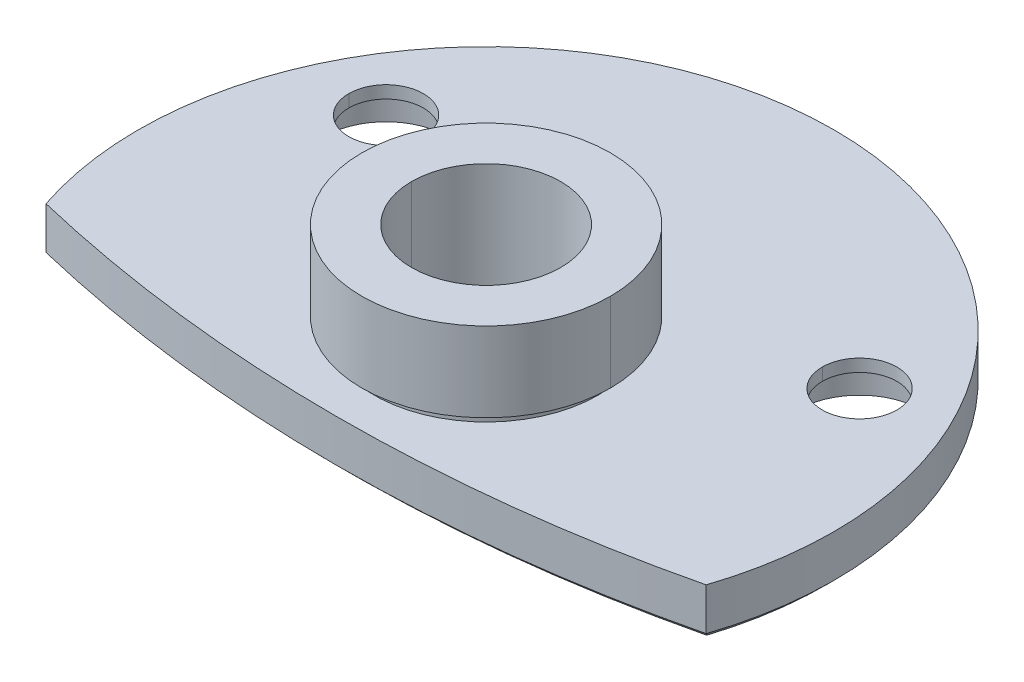
ISO-10303-21;
HEADER;
FILE_DESCRIPTION(('STEP AP214'),'2;1');
FILE_NAME('part.step','',(''),(''),'','','');
FILE_SCHEMA(('AUTOMOTIVE_DESIGN { 1 0 10303 214 1 1 1 1 }'));
ENDSEC;
DATA;
#1=APPLICATION_CONTEXT('core data for automotive mechanical design processes');
#2=APPLICATION_PROTOCOL_DEFINITION('international standard','automotive_design',2000,#1);
#3=PRODUCT_CONTEXT('',#1,'mechanical');
#4=PRODUCT('Part','Part','',(#3));
#5=PRODUCT_RELATED_PRODUCT_CATEGORY('part','',(#4));
#6=PRODUCT_DEFINITION_FORMATION('','',#4);
#7=PRODUCT_DEFINITION_CONTEXT('part definition',#1,'design');
#8=PRODUCT_DEFINITION('design','',#6,#7);
#9=PRODUCT_DEFINITION_SHAPE('','',#8);
#10=(LENGTH_UNIT() NAMED_UNIT(*) SI_UNIT(.MILLI.,.METRE.));
#11=(NAMED_UNIT(*) PLANE_ANGLE_UNIT() SI_UNIT($,.RADIAN.));
#12=(NAMED_UNIT(*) SI_UNIT($,.STERADIAN.) SOLID_ANGLE_UNIT());
#13=UNCERTAINTY_MEASURE_WITH_UNIT(LENGTH_MEASURE(1.E-05),#10,'distance_accuracy_value','');
#14=(GEOMETRIC_REPRESENTATION_CONTEXT(3) GLOBAL_UNCERTAINTY_ASSIGNED_CONTEXT((#13)) GLOBAL_UNIT_ASSIGNED_CONTEXT((#10,
#11,#12)) REPRESENTATION_CONTEXT('',''));
#15=CARTESIAN_POINT('',(0.,0.,0.));
#16=DIRECTION('',(0.,0.,1.));
#17=DIRECTION('',(1.,0.,0.));
#18=AXIS2_PLACEMENT_3D('',#15,#16,#17);
#19=CARTESIAN_POINT('',(9.526279441629,5.7,-5.5));
#20=DIRECTION('',(0.,1.,0.));
#21=DIRECTION('',(1.,0.,0.));
#22=AXIS2_PLACEMENT_3D('',#19,#20,#21);
#23=CYLINDRICAL_SURFACE('',#22,1.5);
#24=DIRECTION('',(0.,-1.,0.));
#25=VECTOR('',#24,1.);
#26=CARTESIAN_POINT('',(8.026279441629,2.,-5.5));
#27=LINE('',#26,#25);
#28=CARTESIAN_POINT('',(8.026279441629,2.,-5.5));
#29=VERTEX_POINT('',#28);
#30=CARTESIAN_POINT('',(8.026279441629,1.5,-5.5));
#31=VERTEX_POINT('',#30);
#32=EDGE_CURVE('E11',#29,#31,#27,.T.);
#33=ORIENTED_EDGE('',*,*,#32,.F.);
#34=CARTESIAN_POINT('',(9.526279441629,2.,-5.5));
#35=DIRECTION('',(0.,1.,0.));
#36=DIRECTION('',(-1.,0.,0.));
#37=AXIS2_PLACEMENT_3D('',#34,#35,#36);
#38=CIRCLE('',#37,1.5);
#39=CARTESIAN_POINT('',(11.02627944163,2.,-5.5));
#40=VERTEX_POINT('',#39);
#41=EDGE_CURVE('E278',#29,#40,#38,.T.);
#42=ORIENTED_EDGE('',*,*,#41,.T.);
#43=DIRECTION('',(0.,-1.,0.));
#44=VECTOR('',#43,1.);
#45=CARTESIAN_POINT('',(11.02627944163,2.,-5.5));
#46=LINE('',#45,#44);
#47=CARTESIAN_POINT('',(11.02627944163,1.5,-5.5));
#48=VERTEX_POINT('',#47);
#49=EDGE_CURVE('E27',#40,#48,#46,.T.);
#50=ORIENTED_EDGE('',*,*,#49,.T.);
#51=CARTESIAN_POINT('',(9.526279441629,1.5,-5.5));
#52=DIRECTION('',(0.,1.,0.));
#53=DIRECTION('',(-1.,0.,0.));
#54=AXIS2_PLACEMENT_3D('',#51,#52,#53);
#55=CIRCLE('',#54,1.5);
#56=EDGE_CURVE('E310',#31,#48,#55,.T.);
#57=ORIENTED_EDGE('',*,*,#56,.F.);
#58=EDGE_LOOP('',(#33,#42,#50,#57));
#59=FACE_BOUND('',#58,.T.);
#60=ADVANCED_FACE('F16',(#59),#23,.F.);
#61=CARTESIAN_POINT('',(9.526279441629,5.7,-5.5));
#62=DIRECTION('',(0.,1.,0.));
#63=DIRECTION('',(1.,0.,0.));
#64=AXIS2_PLACEMENT_3D('',#61,#62,#63);
#65=CYLINDRICAL_SURFACE('',#64,1.5);
#66=ORIENTED_EDGE('',*,*,#49,.F.);
#67=CARTESIAN_POINT('',(9.526279441629,2.,-5.5));
#68=DIRECTION('',(0.,1.,0.));
#69=DIRECTION('',(1.,0.,0.));
#70=AXIS2_PLACEMENT_3D('',#67,#68,#69);
#71=CIRCLE('',#70,1.5);
#72=EDGE_CURVE('E275',#40,#29,#71,.T.);
#73=ORIENTED_EDGE('',*,*,#72,.T.);
#74=ORIENTED_EDGE('',*,*,#32,.T.);
#75=CARTESIAN_POINT('',(9.526279441629,1.5,-5.5));
#76=DIRECTION('',(0.,1.,0.));
#77=DIRECTION('',(1.,0.,0.));
#78=AXIS2_PLACEMENT_3D('',#75,#76,#77);
#79=CIRCLE('',#78,1.5);
#80=EDGE_CURVE('E306',#48,#31,#79,.T.);
#81=ORIENTED_EDGE('',*,*,#80,.F.);
#82=EDGE_LOOP('',(#66,#73,#74,#81));
#83=FACE_BOUND('',#82,.T.);
#84=ADVANCED_FACE('F465',(#83),#65,.F.);
#85=CARTESIAN_POINT('',(-9.526279441629,5.7,-5.5));
#86=DIRECTION('',(0.,1.,0.));
#87=DIRECTION('',(1.,0.,0.));
#88=AXIS2_PLACEMENT_3D('',#85,#86,#87);
#89=CYLINDRICAL_SURFACE('',#88,1.5);
#90=DIRECTION('',(0.,-1.,0.));
#91=VECTOR('',#90,1.);
#92=CARTESIAN_POINT('',(-11.02627944163,2.,-5.5));
#93=LINE('',#92,#91);
#94=CARTESIAN_POINT('',(-11.02627944163,2.,-5.5));
#95=VERTEX_POINT('',#94);
#96=CARTESIAN_POINT('',(-11.02627944163,1.5,-5.5));
#97=VERTEX_POINT('',#96);
#98=EDGE_CURVE('E20',#95,#97,#93,.T.);
#99=ORIENTED_EDGE('',*,*,#98,.F.);
#100=CARTESIAN_POINT('',(-9.526279441629,2.,-5.5));
#101=DIRECTION('',(0.,1.,0.));
#102=DIRECTION('',(-1.,0.,0.));
#103=AXIS2_PLACEMENT_3D('',#100,#101,#102);
#104=CIRCLE('',#103,1.5);
#105=CARTESIAN_POINT('',(-8.026279441629,2.,-5.5));
#106=VERTEX_POINT('',#105);
#107=EDGE_CURVE('E253',#95,#106,#104,.T.);
#108=ORIENTED_EDGE('',*,*,#107,.T.);
#109=DIRECTION('',(0.,-1.,0.));
#110=VECTOR('',#109,1.);
#111=CARTESIAN_POINT('',(-8.026279441629,2.,-5.5));
#112=LINE('',#111,#110);
#113=CARTESIAN_POINT('',(-8.026279441629,1.5,-5.5));
#114=VERTEX_POINT('',#113);
#115=EDGE_CURVE('E232',#106,#114,#112,.T.);
#116=ORIENTED_EDGE('',*,*,#115,.T.);
#117=CARTESIAN_POINT('',(-9.526279441629,1.5,-5.5));
#118=DIRECTION('',(0.,1.,0.));
#119=DIRECTION('',(-1.,0.,0.));
#120=AXIS2_PLACEMENT_3D('',#117,#118,#119);
#121=CIRCLE('',#120,1.5);
#122=EDGE_CURVE('E268',#97,#114,#121,.T.);
#123=ORIENTED_EDGE('',*,*,#122,.F.);
#124=EDGE_LOOP('',(#99,#108,#116,#123));
#125=FACE_BOUND('',#124,.T.);
#126=ADVANCED_FACE('F469',(#125),#89,.F.);
#127=CARTESIAN_POINT('',(9.526279441629,0.,-5.5));
#128=DIRECTION('',(0.,-1.,0.));
#129=DIRECTION('',(1.,0.,0.));
#130=AXIS2_PLACEMENT_3D('',#127,#128,#129);
#131=CYLINDRICAL_SURFACE('',#130,2.5);
#132=DIRECTION('',(0.,1.,0.));
#133=VECTOR('',#132,1.);
#134=CARTESIAN_POINT('',(12.02627944163,0.,-5.5));
#135=LINE('',#134,#133);
#136=CARTESIAN_POINT('',(12.02627944163,0.,-5.5));
#137=VERTEX_POINT('',#136);
#138=CARTESIAN_POINT('',(12.02627944163,1.5,-5.5));
#139=VERTEX_POINT('',#138);
#140=EDGE_CURVE('E246',#137,#139,#135,.T.);
#141=ORIENTED_EDGE('',*,*,#140,.T.);
#142=CARTESIAN_POINT('',(9.526279441629,1.5,-5.5));
#143=DIRECTION('',(0.,-1.,0.));
#144=DIRECTION('',(-1.,0.,0.));
#145=AXIS2_PLACEMENT_3D('',#142,#143,#144);
#146=CIRCLE('',#145,2.5);
#147=CARTESIAN_POINT('',(7.026279441629,1.5,-5.5));
#148=VERTEX_POINT('',#147);
#149=EDGE_CURVE('E319',#148,#139,#146,.T.);
#150=ORIENTED_EDGE('',*,*,#149,.F.);
#151=DIRECTION('',(0.,1.,0.));
#152=VECTOR('',#151,1.);
#153=CARTESIAN_POINT('',(7.026279441629,0.,-5.5));
#154=LINE('',#153,#152);
#155=CARTESIAN_POINT('',(7.026279441629,0.,-5.5));
#156=VERTEX_POINT('',#155);
#157=EDGE_CURVE('E272',#156,#148,#154,.T.);
#158=ORIENTED_EDGE('',*,*,#157,.F.);
#159=CARTESIAN_POINT('',(9.526279441629,0.,-5.5));
#160=DIRECTION('',(0.,-1.,0.));
#161=DIRECTION('',(-1.,0.,0.));
#162=AXIS2_PLACEMENT_3D('',#159,#160,#161);
#163=CIRCLE('',#162,2.5);
#164=EDGE_CURVE('E237',#156,#137,#163,.T.);
#165=ORIENTED_EDGE('',*,*,#164,.T.);
#166=EDGE_LOOP('',(#141,#150,#158,#165));
#167=FACE_BOUND('',#166,.T.);
#168=ADVANCED_FACE('F476',(#167),#131,.F.);
#169=CARTESIAN_POINT('',(9.526279441629,0.,-5.5));
#170=DIRECTION('',(0.,-1.,0.));
#171=DIRECTION('',(1.,0.,0.));
#172=AXIS2_PLACEMENT_3D('',#169,#170,#171);
#173=CYLINDRICAL_SURFACE('',#172,2.5);
#174=ORIENTED_EDGE('',*,*,#157,.T.);
#175=CARTESIAN_POINT('',(9.526279441629,1.5,-5.5));
#176=DIRECTION('',(0.,-1.,0.));
#177=DIRECTION('',(1.,0.,0.));
#178=AXIS2_PLACEMENT_3D('',#175,#176,#177);
#179=CIRCLE('',#178,2.5);
#180=EDGE_CURVE('E315',#139,#148,#179,.T.);
#181=ORIENTED_EDGE('',*,*,#180,.F.);
#182=ORIENTED_EDGE('',*,*,#140,.F.);
#183=CARTESIAN_POINT('',(9.526279441629,0.,-5.5));
#184=DIRECTION('',(0.,-1.,0.));
#185=DIRECTION('',(1.,0.,0.));
#186=AXIS2_PLACEMENT_3D('',#183,#184,#185);
#187=CIRCLE('',#186,2.5);
#188=EDGE_CURVE('E259',#137,#156,#187,.T.);
#189=ORIENTED_EDGE('',*,*,#188,.T.);
#190=EDGE_LOOP('',(#174,#181,#182,#189));
#191=FACE_BOUND('',#190,.T.);
#192=ADVANCED_FACE('F497',(#191),#173,.F.);
#193=CARTESIAN_POINT('',(-9.526279441629,0.,-5.5));
#194=DIRECTION('',(0.,-1.,0.));
#195=DIRECTION('',(1.,0.,0.));
#196=AXIS2_PLACEMENT_3D('',#193,#194,#195);
#197=CYLINDRICAL_SURFACE('',#196,2.5);
#198=DIRECTION('',(0.,1.,0.));
#199=VECTOR('',#198,1.);
#200=CARTESIAN_POINT('',(-7.026279441629,0.,-5.5));
#201=LINE('',#200,#199);
#202=CARTESIAN_POINT('',(-7.026279441629,0.,-5.5));
#203=VERTEX_POINT('',#202);
#204=CARTESIAN_POINT('',(-7.026279441629,1.5,-5.5));
#205=VERTEX_POINT('',#204);
#206=EDGE_CURVE('E55',#203,#205,#201,.T.);
#207=ORIENTED_EDGE('',*,*,#206,.T.);
#208=CARTESIAN_POINT('',(-9.526279441629,1.5,-5.5));
#209=DIRECTION('',(0.,-1.,0.));
#210=DIRECTION('',(-1.,0.,0.));
#211=AXIS2_PLACEMENT_3D('',#208,#209,#210);
#212=CIRCLE('',#211,2.5);
#213=CARTESIAN_POINT('',(-12.02627944163,1.5,-5.5));
#214=VERTEX_POINT('',#213);
#215=EDGE_CURVE('E269',#214,#205,#212,.T.);
#216=ORIENTED_EDGE('',*,*,#215,.F.);
#217=DIRECTION('',(0.,1.,0.));
#218=VECTOR('',#217,1.);
#219=CARTESIAN_POINT('',(-12.02627944163,0.,-5.5));
#220=LINE('',#219,#218);
#221=CARTESIAN_POINT('',(-12.02627944163,0.,-5.5));
#222=VERTEX_POINT('',#221);
#223=EDGE_CURVE('E72',#222,#214,#220,.T.);
#224=ORIENTED_EDGE('',*,*,#223,.F.);
#225=CARTESIAN_POINT('',(-9.526279441629,0.,-5.5));
#226=DIRECTION('',(0.,-1.,0.));
#227=DIRECTION('',(-1.,0.,0.));
#228=AXIS2_PLACEMENT_3D('',#225,#226,#227);
#229=CIRCLE('',#228,2.5);
#230=EDGE_CURVE('E238',#222,#203,#229,.T.);
#231=ORIENTED_EDGE('',*,*,#230,.T.);
#232=EDGE_LOOP('',(#207,#216,#224,#231));
#233=FACE_BOUND('',#232,.T.);
#234=ADVANCED_FACE('F538',(#233),#197,.F.);
#235=CARTESIAN_POINT('',(-9.526279441629,0.,-5.5));
#236=DIRECTION('',(0.,-1.,0.));
#237=DIRECTION('',(1.,0.,0.));
#238=AXIS2_PLACEMENT_3D('',#235,#236,#237);
#239=CYLINDRICAL_SURFACE('',#238,2.5);
#240=ORIENTED_EDGE('',*,*,#223,.T.);
#241=CARTESIAN_POINT('',(-9.526279441629,1.5,-5.5));
#242=DIRECTION('',(0.,-1.,0.));
#243=DIRECTION('',(1.,0.,0.));
#244=AXIS2_PLACEMENT_3D('',#241,#242,#243);
#245=CIRCLE('',#244,2.5);
#246=EDGE_CURVE('E264',#205,#214,#245,.T.);
#247=ORIENTED_EDGE('',*,*,#246,.F.);
#248=ORIENTED_EDGE('',*,*,#206,.F.);
#249=CARTESIAN_POINT('',(-9.526279441629,0.,-5.5));
#250=DIRECTION('',(0.,-1.,0.));
#251=DIRECTION('',(1.,0.,0.));
#252=AXIS2_PLACEMENT_3D('',#249,#250,#251);
#253=CIRCLE('',#252,2.5);
#254=EDGE_CURVE('E234',#203,#222,#253,.T.);
#255=ORIENTED_EDGE('',*,*,#254,.T.);
#256=EDGE_LOOP('',(#240,#247,#248,#255));
#257=FACE_BOUND('',#256,.T.);
#258=ADVANCED_FACE('F541',(#257),#239,.F.);
#259=CARTESIAN_POINT('',(0.,1.5,0.));
#260=DIRECTION('',(0.,-1.,0.));
#261=DIRECTION('',(0.,0.,-1.));
#262=AXIS2_PLACEMENT_3D('',#259,#260,#261);
#263=PLANE('',#262);
#264=ORIENTED_EDGE('',*,*,#56,.T.);
#265=ORIENTED_EDGE('',*,*,#80,.T.);
#266=EDGE_LOOP('',(#264,#265));
#267=FACE_BOUND('',#266,.T.);
#268=ORIENTED_EDGE('',*,*,#149,.T.);
#269=ORIENTED_EDGE('',*,*,#180,.T.);
#270=EDGE_LOOP('',(#268,#269));
#271=FACE_BOUND('',#270,.T.);
#272=ADVANCED_FACE('F545',(#267,#271),#263,.T.);
#273=CARTESIAN_POINT('',(0.,1.5,0.));
#274=DIRECTION('',(0.,-1.,0.));
#275=DIRECTION('',(0.,0.,-1.));
#276=AXIS2_PLACEMENT_3D('',#273,#274,#275);
#277=PLANE('',#276);
#278=ORIENTED_EDGE('',*,*,#122,.T.);
#279=CARTESIAN_POINT('',(-9.526279441629,1.5,-5.5));
#280=DIRECTION('',(0.,1.,0.));
#281=DIRECTION('',(1.,0.,0.));
#282=AXIS2_PLACEMENT_3D('',#279,#280,#281);
#283=CIRCLE('',#282,1.5);
#284=EDGE_CURVE('E314',#114,#97,#283,.T.);
#285=ORIENTED_EDGE('',*,*,#284,.T.);
#286=EDGE_LOOP('',(#278,#285));
#287=FACE_BOUND('',#286,.T.);
#288=ORIENTED_EDGE('',*,*,#215,.T.);
#289=ORIENTED_EDGE('',*,*,#246,.T.);
#290=EDGE_LOOP('',(#288,#289));
#291=FACE_BOUND('',#290,.T.);
#292=ADVANCED_FACE('F493',(#287,#291),#277,.T.);
#293=CARTESIAN_POINT('',(-9.526279441629,5.7,-5.5));
#294=DIRECTION('',(0.,1.,0.));
#295=DIRECTION('',(1.,0.,0.));
#296=AXIS2_PLACEMENT_3D('',#293,#294,#295);
#297=CYLINDRICAL_SURFACE('',#296,1.5);
#298=ORIENTED_EDGE('',*,*,#115,.F.);
#299=CARTESIAN_POINT('',(-9.526279441629,2.,-5.5));
#300=DIRECTION('',(0.,1.,0.));
#301=DIRECTION('',(1.,0.,0.));
#302=AXIS2_PLACEMENT_3D('',#299,#300,#301);
#303=CIRCLE('',#302,1.5);
#304=EDGE_CURVE('E257',#106,#95,#303,.T.);
#305=ORIENTED_EDGE('',*,*,#304,.T.);
#306=ORIENTED_EDGE('',*,*,#98,.T.);
#307=ORIENTED_EDGE('',*,*,#284,.F.);
#308=EDGE_LOOP('',(#298,#305,#306,#307));
#309=FACE_BOUND('',#308,.T.);
#310=ADVANCED_FACE('F488',(#309),#297,.F.);
#311=CARTESIAN_POINT('',(0.,2.,-50.9));
#312=DIRECTION('',(0.,1.,0.));
#313=DIRECTION('',(1.,0.,0.));
#314=AXIS2_PLACEMENT_3D('',#311,#312,#313);
#315=CYLINDRICAL_SURFACE('',#314,56.9);
#316=DIRECTION('',(0.,1.,0.));
#317=VECTOR('',#316,1.);
#318=CARTESIAN_POINT('',(13.28119877458,0.3,4.428290766208));
#319=LINE('',#318,#317);
#320=CARTESIAN_POINT('',(13.28119877458,0.3,4.428290766208));
#321=VERTEX_POINT('',#320);
#322=CARTESIAN_POINT('',(13.28119877458,2.,4.428290766208));
#323=VERTEX_POINT('',#322);
#324=EDGE_CURVE('E209',#321,#323,#319,.T.);
#325=ORIENTED_EDGE('',*,*,#324,.T.);
#326=CARTESIAN_POINT('',(0.,2.,-50.9));
#327=DIRECTION('',(0.,1.,0.));
#328=DIRECTION('',(-0.233412983735995,0.,0.972377693606481));
#329=AXIS2_PLACEMENT_3D('',#326,#327,#328);
#330=CIRCLE('',#329,56.9);
#331=CARTESIAN_POINT('',(-13.28119877458,2.,4.428290766208));
#332=VERTEX_POINT('',#331);
#333=EDGE_CURVE('E196',#332,#323,#330,.T.);
#334=ORIENTED_EDGE('',*,*,#333,.F.);
#335=DIRECTION('',(0.,1.,0.));
#336=VECTOR('',#335,1.);
#337=CARTESIAN_POINT('',(-13.28119877458,0.3,4.428290766208));
#338=LINE('',#337,#336);
#339=CARTESIAN_POINT('',(-13.28119877458,0.3,4.428290766208));
#340=VERTEX_POINT('',#339);
#341=EDGE_CURVE('E211',#340,#332,#338,.T.);
#342=ORIENTED_EDGE('',*,*,#341,.F.);
#343=CARTESIAN_POINT('',(0.,0.3,-50.9));
#344=DIRECTION('',(0.,1.,0.));
#345=DIRECTION('',(-0.233412983735995,0.,0.972377693606481));
#346=AXIS2_PLACEMENT_3D('',#343,#344,#345);
#347=CIRCLE('',#346,56.9);
#348=EDGE_CURVE('E217',#340,#321,#347,.T.);
#349=ORIENTED_EDGE('',*,*,#348,.T.);
#350=EDGE_LOOP('',(#325,#334,#342,#349));
#351=FACE_BOUND('',#350,.T.);
#352=ADVANCED_FACE('F215',(#351),#315,.T.);
#353=CARTESIAN_POINT('',(0.,5.7,0.));
#354=DIRECTION('',(0.,1.,0.));
#355=DIRECTION('',(1.,0.,0.));
#356=AXIS2_PLACEMENT_3D('',#353,#354,#355);
#357=CYLINDRICAL_SURFACE('',#356,3.);
#358=DIRECTION('',(0.,-1.,0.));
#359=VECTOR('',#358,1.);
#360=CARTESIAN_POINT('',(-3.,5.7,0.));
#361=LINE('',#360,#359);
#362=CARTESIAN_POINT('',(-3.,5.7,0.));
#363=VERTEX_POINT('',#362);
#364=CARTESIAN_POINT('',(-3.,0.5,0.));
#365=VERTEX_POINT('',#364);
#366=EDGE_CURVE('E361',#363,#365,#361,.T.);
#367=ORIENTED_EDGE('',*,*,#366,.F.);
#368=CARTESIAN_POINT('',(0.,5.7,0.));
#369=DIRECTION('',(0.,1.,0.));
#370=DIRECTION('',(-1.,0.,0.));
#371=AXIS2_PLACEMENT_3D('',#368,#369,#370);
#372=CIRCLE('',#371,3.);
#373=CARTESIAN_POINT('',(3.,5.7,0.));
#374=VERTEX_POINT('',#373);
#375=EDGE_CURVE('E337',#363,#374,#372,.T.);
#376=ORIENTED_EDGE('',*,*,#375,.T.);
#377=DIRECTION('',(0.,-1.,0.));
#378=VECTOR('',#377,1.);
#379=CARTESIAN_POINT('',(3.,5.7,0.));
#380=LINE('',#379,#378);
#381=CARTESIAN_POINT('',(3.,0.5,0.));
#382=VERTEX_POINT('',#381);
#383=EDGE_CURVE('E336',#374,#382,#380,.T.);
#384=ORIENTED_EDGE('',*,*,#383,.T.);
#385=CARTESIAN_POINT('',(0.,0.5,0.));
#386=DIRECTION('',(0.,1.,0.));
#387=DIRECTION('',(-1.,0.,0.));
#388=AXIS2_PLACEMENT_3D('',#385,#386,#387);
#389=CIRCLE('',#388,3.);
#390=EDGE_CURVE('E300',#365,#382,#389,.T.);
#391=ORIENTED_EDGE('',*,*,#390,.F.);
#392=EDGE_LOOP('',(#367,#376,#384,#391));
#393=FACE_BOUND('',#392,.T.);
#394=ADVANCED_FACE('F18',(#393),#357,.F.);
#395=CARTESIAN_POINT('',(0.,0.,0.));
#396=DIRECTION('',(0.,-1.,0.));
#397=DIRECTION('',(1.,0.,0.));
#398=AXIS2_PLACEMENT_3D('',#395,#396,#397);
#399=CYLINDRICAL_SURFACE('',#398,5.25);
#400=DIRECTION('',(0.,1.,0.));
#401=VECTOR('',#400,1.);
#402=CARTESIAN_POINT('',(5.25,0.,0.));
#403=LINE('',#402,#401);
#404=CARTESIAN_POINT('',(5.25,0.,0.));
#405=VERTEX_POINT('',#404);
#406=CARTESIAN_POINT('',(5.25,0.5,0.));
#407=VERTEX_POINT('',#406);
#408=EDGE_CURVE('E230',#405,#407,#403,.T.);
#409=ORIENTED_EDGE('',*,*,#408,.T.);
#410=CARTESIAN_POINT('',(0.,0.5,0.));
#411=DIRECTION('',(0.,-1.,0.));
#412=DIRECTION('',(-1.,0.,0.));
#413=AXIS2_PLACEMENT_3D('',#410,#411,#412);
#414=CIRCLE('',#413,5.25);
#415=CARTESIAN_POINT('',(-5.25,0.5,0.));
#416=VERTEX_POINT('',#415);
#417=EDGE_CURVE('E301',#416,#407,#414,.T.);
#418=ORIENTED_EDGE('',*,*,#417,.F.);
#419=DIRECTION('',(0.,1.,0.));
#420=VECTOR('',#419,1.);
#421=CARTESIAN_POINT('',(-5.25,0.,0.));
#422=LINE('',#421,#420);
#423=CARTESIAN_POINT('',(-5.25,0.,0.));
#424=VERTEX_POINT('',#423);
#425=EDGE_CURVE('E233',#424,#416,#422,.T.);
#426=ORIENTED_EDGE('',*,*,#425,.F.);
#427=CARTESIAN_POINT('',(0.,0.,0.));
#428=DIRECTION('',(0.,-1.,0.));
#429=DIRECTION('',(-1.,0.,0.));
#430=AXIS2_PLACEMENT_3D('',#427,#428,#429);
#431=CIRCLE('',#430,5.25);
#432=EDGE_CURVE('E263',#424,#405,#431,.T.);
#433=ORIENTED_EDGE('',*,*,#432,.T.);
#434=EDGE_LOOP('',(#409,#418,#426,#433));
#435=FACE_BOUND('',#434,.T.);
#436=ADVANCED_FACE('F435',(#435),#399,.F.);
#437=CARTESIAN_POINT('',(0.,0.,0.));
#438=DIRECTION('',(0.,-1.,0.));
#439=DIRECTION('',(1.,0.,0.));
#440=AXIS2_PLACEMENT_3D('',#437,#438,#439);
#441=CYLINDRICAL_SURFACE('',#440,5.25);
#442=ORIENTED_EDGE('',*,*,#425,.T.);
#443=CARTESIAN_POINT('',(0.,0.5,0.));
#444=DIRECTION('',(0.,-1.,0.));
#445=DIRECTION('',(1.,0.,0.));
#446=AXIS2_PLACEMENT_3D('',#443,#444,#445);
#447=CIRCLE('',#446,5.25);
#448=EDGE_CURVE('E296',#407,#416,#447,.T.);
#449=ORIENTED_EDGE('',*,*,#448,.F.);
#450=ORIENTED_EDGE('',*,*,#408,.F.);
#451=CARTESIAN_POINT('',(0.,0.,0.));
#452=DIRECTION('',(0.,-1.,0.));
#453=DIRECTION('',(1.,0.,0.));
#454=AXIS2_PLACEMENT_3D('',#451,#452,#453);
#455=CIRCLE('',#454,5.25);
#456=EDGE_CURVE('E290',#405,#424,#455,.T.);
#457=ORIENTED_EDGE('',*,*,#456,.T.);
#458=EDGE_LOOP('',(#442,#449,#450,#457));
#459=FACE_BOUND('',#458,.T.);
#460=ADVANCED_FACE('F430',(#459),#441,.F.);
#461=CARTESIAN_POINT('',(0.,0.5,0.));
#462=DIRECTION('',(0.,-1.,0.));
#463=DIRECTION('',(0.,0.,-1.));
#464=AXIS2_PLACEMENT_3D('',#461,#462,#463);
#465=PLANE('',#464);
#466=ORIENTED_EDGE('',*,*,#390,.T.);
#467=CARTESIAN_POINT('',(0.,0.5,0.));
#468=DIRECTION('',(0.,1.,0.));
#469=DIRECTION('',(1.,0.,0.));
#470=AXIS2_PLACEMENT_3D('',#467,#468,#469);
#471=CIRCLE('',#470,3.);
#472=EDGE_CURVE('E341',#382,#365,#471,.T.);
#473=ORIENTED_EDGE('',*,*,#472,.T.);
#474=EDGE_LOOP('',(#466,#473));
#475=FACE_BOUND('',#474,.T.);
#476=ORIENTED_EDGE('',*,*,#417,.T.);
#477=ORIENTED_EDGE('',*,*,#448,.T.);
#478=EDGE_LOOP('',(#476,#477));
#479=FACE_BOUND('',#478,.T.);
#480=ADVANCED_FACE('F427',(#475,#479),#465,.T.);
#481=CARTESIAN_POINT('',(0.,5.7,0.));
#482=DIRECTION('',(0.,1.,0.));
#483=DIRECTION('',(1.,0.,0.));
#484=AXIS2_PLACEMENT_3D('',#481,#482,#483);
#485=CYLINDRICAL_SURFACE('',#484,3.);
#486=ORIENTED_EDGE('',*,*,#383,.F.);
#487=CARTESIAN_POINT('',(0.,5.7,0.));
#488=DIRECTION('',(0.,1.,0.));
#489=DIRECTION('',(1.,0.,0.));
#490=AXIS2_PLACEMENT_3D('',#487,#488,#489);
#491=CIRCLE('',#490,3.);
#492=EDGE_CURVE('E332',#374,#363,#491,.T.);
#493=ORIENTED_EDGE('',*,*,#492,.T.);
#494=ORIENTED_EDGE('',*,*,#366,.T.);
#495=ORIENTED_EDGE('',*,*,#472,.F.);
#496=EDGE_LOOP('',(#486,#493,#494,#495));
#497=FACE_BOUND('',#496,.T.);
#498=ADVANCED_FACE('F424',(#497),#485,.F.);
#499=CARTESIAN_POINT('',(0.,5.7,0.));
#500=DIRECTION('',(0.,1.,0.));
#501=DIRECTION('',(1.,0.,0.));
#502=AXIS2_PLACEMENT_3D('',#499,#500,#501);
#503=PLANE('',#502);
#504=ORIENTED_EDGE('',*,*,#375,.F.);
#505=ORIENTED_EDGE('',*,*,#492,.F.);
#506=EDGE_LOOP('',(#504,#505));
#507=FACE_BOUND('',#506,.T.);
#508=CARTESIAN_POINT('',(0.,5.7,0.));
#509=DIRECTION('',(0.,1.,0.));
#510=DIRECTION('',(-1.,0.,0.));
#511=AXIS2_PLACEMENT_3D('',#508,#509,#510);
#512=CIRCLE('',#511,5.);
#513=CARTESIAN_POINT('',(-5.,5.7,0.));
#514=VERTEX_POINT('',#513);
#515=CARTESIAN_POINT('',(5.,5.7,0.));
#516=VERTEX_POINT('',#515);
#517=EDGE_CURVE('E387',#514,#516,#512,.T.);
#518=ORIENTED_EDGE('',*,*,#517,.T.);
#519=CARTESIAN_POINT('',(0.,5.7,0.));
#520=DIRECTION('',(0.,1.,0.));
#521=DIRECTION('',(1.,0.,0.));
#522=AXIS2_PLACEMENT_3D('',#519,#520,#521);
#523=CIRCLE('',#522,5.);
#524=EDGE_CURVE('E250',#516,#514,#523,.T.);
#525=ORIENTED_EDGE('',*,*,#524,.T.);
#526=EDGE_LOOP('',(#518,#525));
#527=FACE_BOUND('',#526,.T.);
#528=ADVANCED_FACE('F421',(#507,#527),#503,.T.);
#529=CARTESIAN_POINT('',(0.,2.,0.));
#530=DIRECTION('',(0.,1.,0.));
#531=DIRECTION('',(1.,0.,0.));
#532=AXIS2_PLACEMENT_3D('',#529,#530,#531);
#533=CYLINDRICAL_SURFACE('',#532,5.);
#534=DIRECTION('',(0.,1.,0.));
#535=VECTOR('',#534,1.);
#536=CARTESIAN_POINT('',(5.,2.5,0.));
#537=LINE('',#536,#535);
#538=CARTESIAN_POINT('',(5.,2.5,0.));
#539=VERTEX_POINT('',#538);
#540=EDGE_CURVE('E331',#539,#516,#537,.T.);
#541=ORIENTED_EDGE('',*,*,#540,.T.);
#542=ORIENTED_EDGE('',*,*,#517,.F.);
#543=DIRECTION('',(0.,1.,0.));
#544=VECTOR('',#543,1.);
#545=CARTESIAN_POINT('',(-5.,2.5,0.));
#546=LINE('',#545,#544);
#547=CARTESIAN_POINT('',(-5.,2.5,0.));
#548=VERTEX_POINT('',#547);
#549=EDGE_CURVE('E247',#548,#514,#546,.T.);
#550=ORIENTED_EDGE('',*,*,#549,.F.);
#551=CARTESIAN_POINT('',(0.,2.5,0.));
#552=DIRECTION('',(0.,1.,0.));
#553=DIRECTION('',(-1.,0.,0.));
#554=AXIS2_PLACEMENT_3D('',#551,#552,#553);
#555=CIRCLE('',#554,5.);
#556=EDGE_CURVE('E372',#548,#539,#555,.T.);
#557=ORIENTED_EDGE('',*,*,#556,.T.);
#558=EDGE_LOOP('',(#541,#542,#550,#557));
#559=FACE_BOUND('',#558,.T.);
#560=ADVANCED_FACE('F523',(#559),#533,.T.);
#561=CARTESIAN_POINT('',(0.,2.,0.));
#562=DIRECTION('',(0.,1.,0.));
#563=DIRECTION('',(1.,0.,0.));
#564=AXIS2_PLACEMENT_3D('',#561,#562,#563);
#565=CYLINDRICAL_SURFACE('',#564,5.);
#566=ORIENTED_EDGE('',*,*,#549,.T.);
#567=ORIENTED_EDGE('',*,*,#524,.F.);
#568=ORIENTED_EDGE('',*,*,#540,.F.);
#569=CARTESIAN_POINT('',(0.,2.5,0.));
#570=DIRECTION('',(0.,1.,0.));
#571=DIRECTION('',(1.,0.,0.));
#572=AXIS2_PLACEMENT_3D('',#569,#570,#571);
#573=CIRCLE('',#572,5.);
#574=EDGE_CURVE('E251',#539,#548,#573,.T.);
#575=ORIENTED_EDGE('',*,*,#574,.T.);
#576=EDGE_LOOP('',(#566,#567,#568,#575));
#577=FACE_BOUND('',#576,.T.);
#578=ADVANCED_FACE('F518',(#577),#565,.T.);
#579=CARTESIAN_POINT('',(0.,2.5,0.));
#580=DIRECTION('',(0.,1.,0.));
#581=DIRECTION('',(1.,0.,0.));
#582=AXIS2_PLACEMENT_3D('',#579,#580,#581);
#583=PLANE('',#582);
#584=CARTESIAN_POINT('',(0.,2.5,0.));
#585=DIRECTION('',(0.,1.,0.));
#586=DIRECTION('',(1.,0.,0.));
#587=AXIS2_PLACEMENT_3D('',#584,#585,#586);
#588=CIRCLE('',#587,4.5);
#589=CARTESIAN_POINT('',(4.5,2.5,0.));
#590=VERTEX_POINT('',#589);
#591=CARTESIAN_POINT('',(-4.5,2.5,0.));
#592=VERTEX_POINT('',#591);
#593=EDGE_CURVE('E302',#590,#592,#588,.T.);
#594=ORIENTED_EDGE('',*,*,#593,.T.);
#595=CARTESIAN_POINT('',(0.,2.5,0.));
#596=DIRECTION('',(0.,-1.,0.));
#597=DIRECTION('',(1.,0.,0.));
#598=AXIS2_PLACEMENT_3D('',#595,#596,#597);
#599=CIRCLE('',#598,4.5);
#600=EDGE_CURVE('E353',#590,#592,#599,.T.);
#601=ORIENTED_EDGE('',*,*,#600,.F.);
#602=EDGE_LOOP('',(#594,#601));
#603=FACE_BOUND('',#602,.T.);
#604=ORIENTED_EDGE('',*,*,#556,.F.);
#605=ORIENTED_EDGE('',*,*,#574,.F.);
#606=EDGE_LOOP('',(#604,#605));
#607=FACE_BOUND('',#606,.T.);
#608=ADVANCED_FACE('F515',(#603,#607),#583,.F.);
#609=CARTESIAN_POINT('',(0.,1.975,0.));
#610=DIRECTION('',(0.,1.,0.));
#611=DIRECTION('',(1.,0.,0.));
#612=AXIS2_PLACEMENT_3D('',#609,#610,#611);
#613=CYLINDRICAL_SURFACE('',#612,4.5);
#614=ORIENTED_EDGE('',*,*,#600,.T.);
#615=DIRECTION('',(0.,-1.,0.));
#616=VECTOR('',#615,1.);
#617=CARTESIAN_POINT('',(-4.5,2.5,0.));
#618=LINE('',#617,#616);
#619=CARTESIAN_POINT('',(-4.5,2.,0.));
#620=VERTEX_POINT('',#619);
#621=EDGE_CURVE('E171',#592,#620,#618,.T.);
#622=ORIENTED_EDGE('',*,*,#621,.T.);
#623=CARTESIAN_POINT('',(0.,2.,0.));
#624=DIRECTION('',(0.,-1.,0.));
#625=DIRECTION('',(1.,0.,0.));
#626=AXIS2_PLACEMENT_3D('',#623,#624,#625);
#627=CIRCLE('',#626,4.5);
#628=CARTESIAN_POINT('',(4.5,2.,0.));
#629=VERTEX_POINT('',#628);
#630=EDGE_CURVE('E204',#629,#620,#627,.T.);
#631=ORIENTED_EDGE('',*,*,#630,.F.);
#632=DIRECTION('',(0.,-1.,0.));
#633=VECTOR('',#632,1.);
#634=CARTESIAN_POINT('',(4.5,2.5,0.));
#635=LINE('',#634,#633);
#636=EDGE_CURVE('E185',#590,#629,#635,.T.);
#637=ORIENTED_EDGE('',*,*,#636,.F.);
#638=EDGE_LOOP('',(#614,#622,#631,#637));
#639=FACE_BOUND('',#638,.T.);
#640=ADVANCED_FACE('F505',(#639),#613,.T.);
#641=CARTESIAN_POINT('',(0.,1.975,0.));
#642=DIRECTION('',(0.,1.,0.));
#643=DIRECTION('',(1.,0.,0.));
#644=AXIS2_PLACEMENT_3D('',#641,#642,#643);
#645=CYLINDRICAL_SURFACE('',#644,4.5);
#646=CARTESIAN_POINT('',(0.,2.,0.));
#647=DIRECTION('',(0.,1.,0.));
#648=DIRECTION('',(1.,0.,0.));
#649=AXIS2_PLACEMENT_3D('',#646,#647,#648);
#650=CIRCLE('',#649,4.5);
#651=EDGE_CURVE('E258',#629,#620,#650,.T.);
#652=ORIENTED_EDGE('',*,*,#651,.T.);
#653=ORIENTED_EDGE('',*,*,#621,.F.);
#654=ORIENTED_EDGE('',*,*,#593,.F.);
#655=ORIENTED_EDGE('',*,*,#636,.T.);
#656=EDGE_LOOP('',(#652,#653,#654,#655));
#657=FACE_BOUND('',#656,.T.);
#658=ADVANCED_FACE('F500',(#657),#645,.T.);
#659=CARTESIAN_POINT('',(0.,2.,0.));
#660=DIRECTION('',(0.,1.,0.));
#661=DIRECTION('',(1.,0.,0.));
#662=AXIS2_PLACEMENT_3D('',#659,#660,#661);
#663=PLANE('',#662);
#664=ORIENTED_EDGE('',*,*,#41,.F.);
#665=ORIENTED_EDGE('',*,*,#72,.F.);
#666=EDGE_LOOP('',(#664,#665));
#667=FACE_BOUND('',#666,.T.);
#668=ORIENTED_EDGE('',*,*,#107,.F.);
#669=ORIENTED_EDGE('',*,*,#304,.F.);
#670=EDGE_LOOP('',(#668,#669));
#671=FACE_BOUND('',#670,.T.);
#672=ORIENTED_EDGE('',*,*,#630,.T.);
#673=ORIENTED_EDGE('',*,*,#651,.F.);
#674=EDGE_LOOP('',(#672,#673));
#675=FACE_BOUND('',#674,.T.);
#676=CARTESIAN_POINT('',(0.,2.,0.));
#677=DIRECTION('',(0.,1.,0.));
#678=DIRECTION('',(0.948657055327168,0.,0.31630648330059));
#679=AXIS2_PLACEMENT_3D('',#676,#677,#678);
#680=CIRCLE('',#679,14.);
#681=EDGE_CURVE('E199',#323,#332,#680,.T.);
#682=ORIENTED_EDGE('',*,*,#681,.T.);
#683=ORIENTED_EDGE('',*,*,#333,.T.);
#684=EDGE_LOOP('',(#682,#683));
#685=FACE_BOUND('',#684,.T.);
#686=ADVANCED_FACE('F198',(#667,#671,#675,#685),#663,.T.);
#687=CARTESIAN_POINT('',(0.,0.,0.));
#688=DIRECTION('',(0.,1.,0.));
#689=DIRECTION('',(1.,0.,0.));
#690=AXIS2_PLACEMENT_3D('',#687,#688,#689);
#691=CYLINDRICAL_SURFACE('',#690,14.);
#692=ORIENTED_EDGE('',*,*,#324,.F.);
#693=CARTESIAN_POINT('',(0.,0.3,0.));
#694=DIRECTION('',(0.,-1.,0.));
#695=DIRECTION('',(-0.948657055327168,0.,0.31630648330059));
#696=AXIS2_PLACEMENT_3D('',#693,#694,#695);
#697=CIRCLE('',#696,14.);
#698=EDGE_CURVE('E220',#340,#321,#697,.T.);
#699=ORIENTED_EDGE('',*,*,#698,.F.);
#700=ORIENTED_EDGE('',*,*,#341,.T.);
#701=ORIENTED_EDGE('',*,*,#681,.F.);
#702=EDGE_LOOP('',(#692,#699,#700,#701));
#703=FACE_BOUND('',#702,.T.);
#704=ADVANCED_FACE('F207',(#703),#691,.T.);
#705=CARTESIAN_POINT('',(0.,0.15,0.));
#706=DIRECTION('',(0.,1.,0.));
#707=DIRECTION('',(1.,0.,0.));
#708=AXIS2_PLACEMENT_3D('',#705,#706,#707);
#709=CONICAL_SURFACE('',#708,13.85,0.7853981633973);
#710=CARTESIAN_POINT('',(13.04820615041,0.,4.175442043222));
#711=CARTESIAN_POINT('',(13.12610849527,0.09984325926838,4.259592845238));
#712=CARTESIAN_POINT('',(13.20376902358,0.1998452297306,4.343877413663));
#713=CARTESIAN_POINT('',(13.28119877458,0.3,4.428290766208));
#714=(BOUNDED_CURVE() B_SPLINE_CURVE(3,(#710,#711,#712,#713),.UNSPECIFIED.,.F.,
.F.) B_SPLINE_CURVE_WITH_KNOTS((4,4),(0.,1.),
.UNSPECIFIED.) CURVE() GEOMETRIC_REPRESENTATION_ITEM() RATIONAL_B_SPLINE_CURVE((1.,1.,1.,1.)) REPRESENTATION_ITEM(''));
#715=CARTESIAN_POINT('',(13.04820615041,0.,4.175442043222));
#716=VERTEX_POINT('',#715);
#717=EDGE_CURVE('E282',#716,#321,#714,.T.);
#718=ORIENTED_EDGE('',*,*,#717,.F.);
#719=CARTESIAN_POINT('',(0.,0.,0.));
#720=DIRECTION('',(0.,-1.,0.));
#721=DIRECTION('',(-0.952423806599525,0.,0.304776791476108));
#722=AXIS2_PLACEMENT_3D('',#719,#720,#721);
#723=CIRCLE('',#722,13.7);
#724=CARTESIAN_POINT('',(-13.04820615041,0.,4.175442043222));
#725=VERTEX_POINT('',#724);
#726=EDGE_CURVE('E239',#725,#716,#723,.T.);
#727=ORIENTED_EDGE('',*,*,#726,.F.);
#728=CARTESIAN_POINT('',(-13.04820615041,0.,4.175442043222));
#729=CARTESIAN_POINT('',(-13.12610849527,0.09984325926837,4.259592845238));
#730=CARTESIAN_POINT('',(-13.20376902358,0.1998452297306,4.343877413663));
#731=CARTESIAN_POINT('',(-13.28119877458,0.3,4.428290766208));
#732=(BOUNDED_CURVE() B_SPLINE_CURVE(3,(#728,#729,#730,#731),.UNSPECIFIED.,.F.,
.F.) B_SPLINE_CURVE_WITH_KNOTS((4,4),(0.,1.),
.UNSPECIFIED.) CURVE() GEOMETRIC_REPRESENTATION_ITEM() RATIONAL_B_SPLINE_CURVE((1.,1.,1.,1.)) REPRESENTATION_ITEM(''));
#733=EDGE_CURVE('E227',#725,#340,#732,.T.);
#734=ORIENTED_EDGE('',*,*,#733,.T.);
#735=ORIENTED_EDGE('',*,*,#698,.T.);
#736=EDGE_LOOP('',(#718,#727,#734,#735));
#737=FACE_BOUND('',#736,.T.);
#738=ADVANCED_FACE('F453',(#737),#709,.T.);
#739=CARTESIAN_POINT('',(0.,0.15,-50.9));
#740=DIRECTION('',(0.,1.,0.));
#741=DIRECTION('',(1.,0.,0.));
#742=AXIS2_PLACEMENT_3D('',#739,#740,#741);
#743=CONICAL_SURFACE('',#742,56.75,0.7853981633973);
#744=ORIENTED_EDGE('',*,*,#717,.T.);
#745=ORIENTED_EDGE('',*,*,#348,.F.);
#746=ORIENTED_EDGE('',*,*,#733,.F.);
#747=CARTESIAN_POINT('',(0.,0.,-50.9));
#748=DIRECTION('',(0.,1.,0.));
#749=DIRECTION('',(-0.230533677569101,0.,0.973064347053403));
#750=AXIS2_PLACEMENT_3D('',#747,#748,#749);
#751=CIRCLE('',#750,56.6);
#752=EDGE_CURVE('E243',#725,#716,#751,.T.);
#753=ORIENTED_EDGE('',*,*,#752,.T.);
#754=EDGE_LOOP('',(#744,#745,#746,#753));
#755=FACE_BOUND('',#754,.T.);
#756=ADVANCED_FACE('F443',(#755),#743,.T.);
#757=CARTESIAN_POINT('',(0.,0.,0.));
#758=DIRECTION('',(0.,1.,0.));
#759=DIRECTION('',(1.,0.,0.));
#760=AXIS2_PLACEMENT_3D('',#757,#758,#759);
#761=PLANE('',#760);
#762=ORIENTED_EDGE('',*,*,#432,.F.);
#763=ORIENTED_EDGE('',*,*,#456,.F.);
#764=EDGE_LOOP('',(#762,#763));
#765=FACE_BOUND('',#764,.T.);
#766=ORIENTED_EDGE('',*,*,#164,.F.);
#767=ORIENTED_EDGE('',*,*,#188,.F.);
#768=EDGE_LOOP('',(#766,#767));
#769=FACE_BOUND('',#768,.T.);
#770=ORIENTED_EDGE('',*,*,#230,.F.);
#771=ORIENTED_EDGE('',*,*,#254,.F.);
#772=EDGE_LOOP('',(#770,#771));
#773=FACE_BOUND('',#772,.T.);
#774=ORIENTED_EDGE('',*,*,#726,.T.);
#775=ORIENTED_EDGE('',*,*,#752,.F.);
#776=EDGE_LOOP('',(#774,#775));
#777=FACE_BOUND('',#776,.T.);
#778=ADVANCED_FACE('F440',(#765,#769,#773,#777),#761,.F.);
#779=CLOSED_SHELL('',(#60,#84,#126,#168,#192,#234,#258,#272,#292,#310,#352,#394,#436,#460,#480,
#498,#528,#560,#578,#608,#640,#658,#686,#704,#738,#756,#778));
#780=MANIFOLD_SOLID_BREP('B1',#779);
#781=ADVANCED_BREP_SHAPE_REPRESENTATION('',(#18,#780),#14);
#782=SHAPE_DEFINITION_REPRESENTATION(#9,#781);
ENDSEC;
END-ISO-10303-21;
